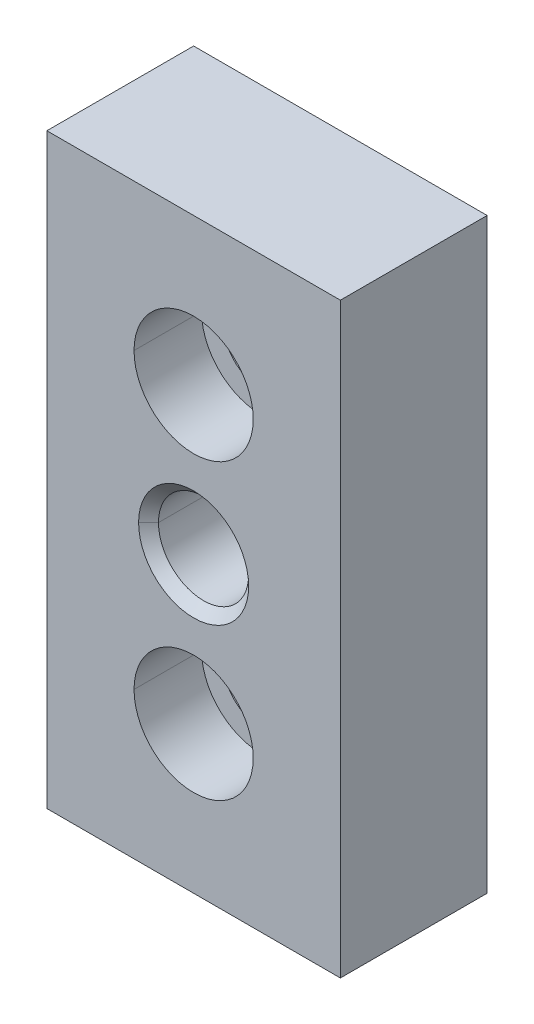
ISO-10303-21;
HEADER;
FILE_DESCRIPTION(('STEP AP214'),'2;1');
FILE_NAME('part.step','',(''),(''),'','','');
FILE_SCHEMA(('AUTOMOTIVE_DESIGN { 1 0 10303 214 1 1 1 1 }'));
ENDSEC;
DATA;
#1=APPLICATION_CONTEXT('core data for automotive mechanical design processes');
#2=APPLICATION_PROTOCOL_DEFINITION('international standard','automotive_design',2000,#1);
#3=PRODUCT_CONTEXT('',#1,'mechanical');
#4=PRODUCT('Part','Part','',(#3));
#5=PRODUCT_RELATED_PRODUCT_CATEGORY('part','',(#4));
#6=PRODUCT_DEFINITION_FORMATION('','',#4);
#7=PRODUCT_DEFINITION_CONTEXT('part definition',#1,'design');
#8=PRODUCT_DEFINITION('design','',#6,#7);
#9=PRODUCT_DEFINITION_SHAPE('','',#8);
#10=(LENGTH_UNIT() NAMED_UNIT(*) SI_UNIT(.MILLI.,.METRE.));
#11=(NAMED_UNIT(*) PLANE_ANGLE_UNIT() SI_UNIT($,.RADIAN.));
#12=(NAMED_UNIT(*) SI_UNIT($,.STERADIAN.) SOLID_ANGLE_UNIT());
#13=UNCERTAINTY_MEASURE_WITH_UNIT(LENGTH_MEASURE(1.E-05),#10,'distance_accuracy_value','');
#14=(GEOMETRIC_REPRESENTATION_CONTEXT(3) GLOBAL_UNCERTAINTY_ASSIGNED_CONTEXT((#13)) GLOBAL_UNIT_ASSIGNED_CONTEXT((#10,
#11,#12)) REPRESENTATION_CONTEXT('',''));
#15=CARTESIAN_POINT('',(0.,0.,0.));
#16=DIRECTION('',(0.,0.,1.));
#17=DIRECTION('',(1.,0.,0.));
#18=AXIS2_PLACEMENT_3D('',#15,#16,#17);
#19=CARTESIAN_POINT('',(-12.7,-25.4,0.));
#20=DIRECTION('',(0.,-1.,0.));
#21=DIRECTION('',(0.,0.,-1.));
#22=AXIS2_PLACEMENT_3D('',#19,#20,#21);
#23=PLANE('',#22);
#24=DIRECTION('',(1.,0.,0.));
#25=VECTOR('',#24,1.);
#26=CARTESIAN_POINT('',(-12.7,-25.4,12.7));
#27=LINE('',#26,#25);
#28=CARTESIAN_POINT('',(-12.7,-25.4,12.7));
#29=VERTEX_POINT('',#28);
#30=CARTESIAN_POINT('',(12.7,-25.4,12.7));
#31=VERTEX_POINT('',#30);
#32=EDGE_CURVE('E11',#29,#31,#27,.T.);
#33=ORIENTED_EDGE('',*,*,#32,.F.);
#34=DIRECTION('',(0.,0.,1.));
#35=VECTOR('',#34,1.);
#36=CARTESIAN_POINT('',(-12.7,-25.4,0.));
#37=LINE('',#36,#35);
#38=CARTESIAN_POINT('',(-12.7,-25.4,0.));
#39=VERTEX_POINT('',#38);
#40=EDGE_CURVE('E25',#39,#29,#37,.T.);
#41=ORIENTED_EDGE('',*,*,#40,.F.);
#42=DIRECTION('',(1.,0.,0.));
#43=VECTOR('',#42,1.);
#44=CARTESIAN_POINT('',(-12.7,-25.4,0.));
#45=LINE('',#44,#43);
#46=CARTESIAN_POINT('',(12.7,-25.4,0.));
#47=VERTEX_POINT('',#46);
#48=EDGE_CURVE('E350',#39,#47,#45,.T.);
#49=ORIENTED_EDGE('',*,*,#48,.T.);
#50=DIRECTION('',(0.,0.,1.));
#51=VECTOR('',#50,1.);
#52=CARTESIAN_POINT('',(12.7,-25.4,0.));
#53=LINE('',#52,#51);
#54=EDGE_CURVE('E346',#47,#31,#53,.T.);
#55=ORIENTED_EDGE('',*,*,#54,.T.);
#56=EDGE_LOOP('',(#33,#41,#49,#55));
#57=FACE_BOUND('',#56,.T.);
#58=ADVANCED_FACE('F17',(#57),#23,.T.);
#59=CARTESIAN_POINT('',(12.7,-25.4,0.));
#60=DIRECTION('',(1.,0.,0.));
#61=DIRECTION('',(0.,0.,-1.));
#62=AXIS2_PLACEMENT_3D('',#59,#60,#61);
#63=PLANE('',#62);
#64=DIRECTION('',(0.,1.,0.));
#65=VECTOR('',#64,1.);
#66=CARTESIAN_POINT('',(12.7,-25.4,12.7));
#67=LINE('',#66,#65);
#68=CARTESIAN_POINT('',(12.7,25.4,12.7));
#69=VERTEX_POINT('',#68);
#70=EDGE_CURVE('E341',#31,#69,#67,.T.);
#71=ORIENTED_EDGE('',*,*,#70,.F.);
#72=ORIENTED_EDGE('',*,*,#54,.F.);
#73=DIRECTION('',(0.,1.,0.));
#74=VECTOR('',#73,1.);
#75=CARTESIAN_POINT('',(12.7,-25.4,0.));
#76=LINE('',#75,#74);
#77=CARTESIAN_POINT('',(12.7,25.4,0.));
#78=VERTEX_POINT('',#77);
#79=EDGE_CURVE('E337',#47,#78,#76,.T.);
#80=ORIENTED_EDGE('',*,*,#79,.T.);
#81=DIRECTION('',(0.,0.,1.));
#82=VECTOR('',#81,1.);
#83=CARTESIAN_POINT('',(12.7,25.4,0.));
#84=LINE('',#83,#82);
#85=EDGE_CURVE('E333',#78,#69,#84,.T.);
#86=ORIENTED_EDGE('',*,*,#85,.T.);
#87=EDGE_LOOP('',(#71,#72,#80,#86));
#88=FACE_BOUND('',#87,.T.);
#89=ADVANCED_FACE('F371',(#88),#63,.T.);
#90=CARTESIAN_POINT('',(12.7,25.4,0.));
#91=DIRECTION('',(0.,1.,0.));
#92=DIRECTION('',(0.,0.,1.));
#93=AXIS2_PLACEMENT_3D('',#90,#91,#92);
#94=PLANE('',#93);
#95=DIRECTION('',(-1.,0.,0.));
#96=VECTOR('',#95,1.);
#97=CARTESIAN_POINT('',(12.7,25.4,12.7));
#98=LINE('',#97,#96);
#99=CARTESIAN_POINT('',(-12.7,25.4,12.7));
#100=VERTEX_POINT('',#99);
#101=EDGE_CURVE('E328',#69,#100,#98,.T.);
#102=ORIENTED_EDGE('',*,*,#101,.F.);
#103=ORIENTED_EDGE('',*,*,#85,.F.);
#104=DIRECTION('',(-1.,0.,0.));
#105=VECTOR('',#104,1.);
#106=CARTESIAN_POINT('',(12.7,25.4,0.));
#107=LINE('',#106,#105);
#108=CARTESIAN_POINT('',(-12.7,25.4,0.));
#109=VERTEX_POINT('',#108);
#110=EDGE_CURVE('E324',#78,#109,#107,.T.);
#111=ORIENTED_EDGE('',*,*,#110,.T.);
#112=DIRECTION('',(0.,0.,1.));
#113=VECTOR('',#112,1.);
#114=CARTESIAN_POINT('',(-12.7,25.4,0.));
#115=LINE('',#114,#113);
#116=EDGE_CURVE('E320',#109,#100,#115,.T.);
#117=ORIENTED_EDGE('',*,*,#116,.T.);
#118=EDGE_LOOP('',(#102,#103,#111,#117));
#119=FACE_BOUND('',#118,.T.);
#120=ADVANCED_FACE('F377',(#119),#94,.T.);
#121=CARTESIAN_POINT('',(-12.7,25.4,0.));
#122=DIRECTION('',(-1.,0.,0.));
#123=DIRECTION('',(0.,0.,1.));
#124=AXIS2_PLACEMENT_3D('',#121,#122,#123);
#125=PLANE('',#124);
#126=DIRECTION('',(0.,-1.,0.));
#127=VECTOR('',#126,1.);
#128=CARTESIAN_POINT('',(-12.7,25.4,12.7));
#129=LINE('',#128,#127);
#130=EDGE_CURVE('E316',#100,#29,#129,.T.);
#131=ORIENTED_EDGE('',*,*,#130,.F.);
#132=ORIENTED_EDGE('',*,*,#116,.F.);
#133=DIRECTION('',(0.,-1.,0.));
#134=VECTOR('',#133,1.);
#135=CARTESIAN_POINT('',(-12.7,25.4,0.));
#136=LINE('',#135,#134);
#137=EDGE_CURVE('E312',#109,#39,#136,.T.);
#138=ORIENTED_EDGE('',*,*,#137,.T.);
#139=ORIENTED_EDGE('',*,*,#40,.T.);
#140=EDGE_LOOP('',(#131,#132,#138,#139));
#141=FACE_BOUND('',#140,.T.);
#142=ADVANCED_FACE('F360',(#141),#125,.T.);
#143=CARTESIAN_POINT('',(0.,0.,0.));
#144=DIRECTION('',(0.,0.,1.));
#145=DIRECTION('',(1.,0.,0.));
#146=AXIS2_PLACEMENT_3D('',#143,#144,#145);
#147=PLANE('',#146);
#148=CARTESIAN_POINT('',(0.,-12.7,0.));
#149=DIRECTION('',(0.,0.,1.));
#150=DIRECTION('',(1.,0.,0.));
#151=AXIS2_PLACEMENT_3D('',#148,#149,#150);
#152=CIRCLE('',#151,3.2639);
#153=CARTESIAN_POINT('',(3.2639,-12.7,0.));
#154=VERTEX_POINT('',#153);
#155=CARTESIAN_POINT('',(-3.2639,-12.7,0.));
#156=VERTEX_POINT('',#155);
#157=EDGE_CURVE('E139',#154,#156,#152,.T.);
#158=ORIENTED_EDGE('',*,*,#157,.T.);
#159=CARTESIAN_POINT('',(0.,-12.7,0.));
#160=DIRECTION('',(0.,0.,1.));
#161=DIRECTION('',(1.,0.,0.));
#162=AXIS2_PLACEMENT_3D('',#159,#160,#161);
#163=CIRCLE('',#162,3.2639);
#164=EDGE_CURVE('E305',#156,#154,#163,.T.);
#165=ORIENTED_EDGE('',*,*,#164,.T.);
#166=EDGE_LOOP('',(#158,#165));
#167=FACE_BOUND('',#166,.T.);
#168=CARTESIAN_POINT('',(0.,12.7,0.));
#169=DIRECTION('',(0.,0.,1.));
#170=DIRECTION('',(1.,0.,0.));
#171=AXIS2_PLACEMENT_3D('',#168,#169,#170);
#172=CIRCLE('',#171,3.2639);
#173=CARTESIAN_POINT('',(3.2639,12.7,0.));
#174=VERTEX_POINT('',#173);
#175=CARTESIAN_POINT('',(-3.2639,12.7,0.));
#176=VERTEX_POINT('',#175);
#177=EDGE_CURVE('E301',#174,#176,#172,.T.);
#178=ORIENTED_EDGE('',*,*,#177,.T.);
#179=CARTESIAN_POINT('',(0.,12.7,0.));
#180=DIRECTION('',(0.,0.,1.));
#181=DIRECTION('',(1.,0.,0.));
#182=AXIS2_PLACEMENT_3D('',#179,#180,#181);
#183=CIRCLE('',#182,3.2639);
#184=EDGE_CURVE('E297',#176,#174,#183,.T.);
#185=ORIENTED_EDGE('',*,*,#184,.T.);
#186=EDGE_LOOP('',(#178,#185));
#187=FACE_BOUND('',#186,.T.);
#188=CARTESIAN_POINT('',(0.,0.,0.));
#189=DIRECTION('',(0.,0.,-1.));
#190=DIRECTION('',(-1.,0.,0.));
#191=AXIS2_PLACEMENT_3D('',#188,#189,#190);
#192=CIRCLE('',#191,4.7625);
#193=CARTESIAN_POINT('',(4.7625,0.,0.));
#194=VERTEX_POINT('',#193);
#195=CARTESIAN_POINT('',(-4.7625,0.,0.));
#196=VERTEX_POINT('',#195);
#197=EDGE_CURVE('E292',#194,#196,#192,.T.);
#198=ORIENTED_EDGE('',*,*,#197,.F.);
#199=CARTESIAN_POINT('',(0.,0.,0.));
#200=DIRECTION('',(0.,0.,-1.));
#201=DIRECTION('',(-1.,0.,0.));
#202=AXIS2_PLACEMENT_3D('',#199,#200,#201);
#203=CIRCLE('',#202,4.7625);
#204=EDGE_CURVE('E287',#196,#194,#203,.T.);
#205=ORIENTED_EDGE('',*,*,#204,.F.);
#206=EDGE_LOOP('',(#198,#205));
#207=FACE_BOUND('',#206,.T.);
#208=ORIENTED_EDGE('',*,*,#48,.F.);
#209=ORIENTED_EDGE('',*,*,#137,.F.);
#210=ORIENTED_EDGE('',*,*,#110,.F.);
#211=ORIENTED_EDGE('',*,*,#79,.F.);
#212=EDGE_LOOP('',(#208,#209,#210,#211));
#213=FACE_BOUND('',#212,.T.);
#214=ADVANCED_FACE('F367',(#167,#187,#207,#213),#147,.F.);
#215=CARTESIAN_POINT('',(0.,0.,0.85979));
#216=DIRECTION('',(0.,0.,-1.));
#217=DIRECTION('',(0.,-1.,0.));
#218=AXIS2_PLACEMENT_3D('',#215,#216,#217);
#219=CONICAL_SURFACE('',#218,3.90271,0.785398163397448);
#220=DIRECTION('',(0.707106781186547,0.,-0.707106781186548));
#221=VECTOR('',#220,1.);
#222=CARTESIAN_POINT('',(3.90271,0.,0.85979));
#223=LINE('',#222,#221);
#224=CARTESIAN_POINT('',(3.90271,0.,0.85979));
#225=VERTEX_POINT('',#224);
#226=EDGE_CURVE('E282',#225,#194,#223,.T.);
#227=ORIENTED_EDGE('',*,*,#226,.F.);
#228=CARTESIAN_POINT('',(0.,0.,0.85979));
#229=DIRECTION('',(0.,0.,-1.));
#230=DIRECTION('',(-1.,0.,0.));
#231=AXIS2_PLACEMENT_3D('',#228,#229,#230);
#232=CIRCLE('',#231,3.90271);
#233=CARTESIAN_POINT('',(-3.90271,0.,0.85979));
#234=VERTEX_POINT('',#233);
#235=EDGE_CURVE('E277',#234,#225,#232,.T.);
#236=ORIENTED_EDGE('',*,*,#235,.F.);
#237=DIRECTION('',(-0.707106781186547,0.,-0.707106781186548));
#238=VECTOR('',#237,1.);
#239=CARTESIAN_POINT('',(-3.90271,0.,0.85979));
#240=LINE('',#239,#238);
#241=EDGE_CURVE('E272',#234,#196,#240,.T.);
#242=ORIENTED_EDGE('',*,*,#241,.T.);
#243=ORIENTED_EDGE('',*,*,#204,.T.);
#244=EDGE_LOOP('',(#227,#236,#242,#243));
#245=FACE_BOUND('',#244,.T.);
#246=ADVANCED_FACE('F420',(#245),#219,.F.);
#247=CARTESIAN_POINT('',(0.,0.,0.85979));
#248=DIRECTION('',(0.,0.,-1.));
#249=DIRECTION('',(0.,1.,0.));
#250=AXIS2_PLACEMENT_3D('',#247,#248,#249);
#251=CONICAL_SURFACE('',#250,3.90271,0.785398163397448);
#252=ORIENTED_EDGE('',*,*,#226,.T.);
#253=ORIENTED_EDGE('',*,*,#197,.T.);
#254=ORIENTED_EDGE('',*,*,#241,.F.);
#255=CARTESIAN_POINT('',(0.,0.,0.85979));
#256=DIRECTION('',(0.,0.,-1.));
#257=DIRECTION('',(-1.,0.,0.));
#258=AXIS2_PLACEMENT_3D('',#255,#256,#257);
#259=CIRCLE('',#258,3.90271);
#260=EDGE_CURVE('E267',#225,#234,#259,.T.);
#261=ORIENTED_EDGE('',*,*,#260,.F.);
#262=EDGE_LOOP('',(#252,#253,#254,#261));
#263=FACE_BOUND('',#262,.T.);
#264=ADVANCED_FACE('F431',(#263),#251,.F.);
#265=CARTESIAN_POINT('',(0.,0.,0.));
#266=DIRECTION('',(0.,0.,-1.));
#267=DIRECTION('',(-5.89359289319345E-10,1.,0.));
#268=AXIS2_PLACEMENT_3D('',#265,#266,#267);
#269=CYLINDRICAL_SURFACE('',#268,3.90271);
#270=DIRECTION('',(0.,0.,-1.));
#271=VECTOR('',#270,1.);
#272=CARTESIAN_POINT('',(3.90271,0.,11.84021));
#273=LINE('',#272,#271);
#274=CARTESIAN_POINT('',(3.90271,0.,11.84021));
#275=VERTEX_POINT('',#274);
#276=EDGE_CURVE('E262',#275,#225,#273,.T.);
#277=ORIENTED_EDGE('',*,*,#276,.T.);
#278=ORIENTED_EDGE('',*,*,#260,.T.);
#279=DIRECTION('',(0.,0.,-1.));
#280=VECTOR('',#279,1.);
#281=CARTESIAN_POINT('',(-3.90271,0.,11.84021));
#282=LINE('',#281,#280);
#283=CARTESIAN_POINT('',(-3.90271,0.,11.84021));
#284=VERTEX_POINT('',#283);
#285=EDGE_CURVE('E257',#284,#234,#282,.T.);
#286=ORIENTED_EDGE('',*,*,#285,.F.);
#287=CARTESIAN_POINT('',(0.,0.,11.84021));
#288=DIRECTION('',(0.,0.,-1.));
#289=DIRECTION('',(-1.,0.,0.));
#290=AXIS2_PLACEMENT_3D('',#287,#288,#289);
#291=CIRCLE('',#290,3.90271);
#292=EDGE_CURVE('E252',#275,#284,#291,.T.);
#293=ORIENTED_EDGE('',*,*,#292,.F.);
#294=EDGE_LOOP('',(#277,#278,#286,#293));
#295=FACE_BOUND('',#294,.T.);
#296=ADVANCED_FACE('F442',(#295),#269,.F.);
#297=CARTESIAN_POINT('',(0.,0.,12.7));
#298=DIRECTION('',(0.,0.,1.));
#299=DIRECTION('',(0.,1.,0.));
#300=AXIS2_PLACEMENT_3D('',#297,#298,#299);
#301=CONICAL_SURFACE('',#300,4.7625,0.785398163397448);
#302=DIRECTION('',(-0.707106781186547,0.,0.707106781186548));
#303=VECTOR('',#302,1.);
#304=CARTESIAN_POINT('',(-3.90271,0.,11.84021));
#305=LINE('',#304,#303);
#306=CARTESIAN_POINT('',(-4.7625,0.,12.7));
#307=VERTEX_POINT('',#306);
#308=EDGE_CURVE('E248',#284,#307,#305,.T.);
#309=ORIENTED_EDGE('',*,*,#308,.T.);
#310=CARTESIAN_POINT('',(0.,0.,12.7));
#311=DIRECTION('',(0.,0.,-1.));
#312=DIRECTION('',(-1.,0.,0.));
#313=AXIS2_PLACEMENT_3D('',#310,#311,#312);
#314=CIRCLE('',#313,4.7625);
#315=CARTESIAN_POINT('',(4.7625,0.,12.7));
#316=VERTEX_POINT('',#315);
#317=EDGE_CURVE('E243',#316,#307,#314,.T.);
#318=ORIENTED_EDGE('',*,*,#317,.F.);
#319=DIRECTION('',(0.707106781186547,0.,0.707106781186548));
#320=VECTOR('',#319,1.);
#321=CARTESIAN_POINT('',(3.90271,0.,11.84021));
#322=LINE('',#321,#320);
#323=EDGE_CURVE('E238',#275,#316,#322,.T.);
#324=ORIENTED_EDGE('',*,*,#323,.F.);
#325=ORIENTED_EDGE('',*,*,#292,.T.);
#326=EDGE_LOOP('',(#309,#318,#324,#325));
#327=FACE_BOUND('',#326,.T.);
#328=ADVANCED_FACE('F453',(#327),#301,.F.);
#329=CARTESIAN_POINT('',(0.,0.,12.7));
#330=DIRECTION('',(0.,0.,1.));
#331=DIRECTION('',(0.,-1.,0.));
#332=AXIS2_PLACEMENT_3D('',#329,#330,#331);
#333=CONICAL_SURFACE('',#332,4.7625,0.785398163397448);
#334=ORIENTED_EDGE('',*,*,#308,.F.);
#335=CARTESIAN_POINT('',(0.,0.,11.84021));
#336=DIRECTION('',(0.,0.,-1.));
#337=DIRECTION('',(-1.,0.,0.));
#338=AXIS2_PLACEMENT_3D('',#335,#336,#337);
#339=CIRCLE('',#338,3.90271);
#340=EDGE_CURVE('E233',#284,#275,#339,.T.);
#341=ORIENTED_EDGE('',*,*,#340,.T.);
#342=ORIENTED_EDGE('',*,*,#323,.T.);
#343=CARTESIAN_POINT('',(0.,0.,12.7));
#344=DIRECTION('',(0.,0.,-1.));
#345=DIRECTION('',(-1.,0.,0.));
#346=AXIS2_PLACEMENT_3D('',#343,#344,#345);
#347=CIRCLE('',#346,4.7625);
#348=EDGE_CURVE('E228',#307,#316,#347,.T.);
#349=ORIENTED_EDGE('',*,*,#348,.F.);
#350=EDGE_LOOP('',(#334,#341,#342,#349));
#351=FACE_BOUND('',#350,.T.);
#352=ADVANCED_FACE('F464',(#351),#333,.F.);
#353=CARTESIAN_POINT('',(0.,0.,12.7));
#354=DIRECTION('',(0.,0.,1.));
#355=DIRECTION('',(1.,0.,0.));
#356=AXIS2_PLACEMENT_3D('',#353,#354,#355);
#357=PLANE('',#356);
#358=CARTESIAN_POINT('',(0.,-12.7,12.7));
#359=DIRECTION('',(0.,0.,1.));
#360=DIRECTION('',(1.,0.,0.));
#361=AXIS2_PLACEMENT_3D('',#358,#359,#360);
#362=CIRCLE('',#361,5.1562);
#363=CARTESIAN_POINT('',(-5.1562,-12.7,12.7));
#364=VERTEX_POINT('',#363);
#365=CARTESIAN_POINT('',(5.1562,-12.7,12.7));
#366=VERTEX_POINT('',#365);
#367=EDGE_CURVE('E223',#364,#366,#362,.T.);
#368=ORIENTED_EDGE('',*,*,#367,.F.);
#369=CARTESIAN_POINT('',(0.,-12.7,12.7));
#370=DIRECTION('',(0.,0.,1.));
#371=DIRECTION('',(1.,0.,0.));
#372=AXIS2_PLACEMENT_3D('',#369,#370,#371);
#373=CIRCLE('',#372,5.1562);
#374=EDGE_CURVE('E218',#366,#364,#373,.T.);
#375=ORIENTED_EDGE('',*,*,#374,.F.);
#376=EDGE_LOOP('',(#368,#375));
#377=FACE_BOUND('',#376,.T.);
#378=CARTESIAN_POINT('',(0.,12.7,12.7));
#379=DIRECTION('',(0.,0.,1.));
#380=DIRECTION('',(1.,0.,0.));
#381=AXIS2_PLACEMENT_3D('',#378,#379,#380);
#382=CIRCLE('',#381,5.1562);
#383=CARTESIAN_POINT('',(-5.1562,12.7,12.7));
#384=VERTEX_POINT('',#383);
#385=CARTESIAN_POINT('',(5.1562,12.7,12.7));
#386=VERTEX_POINT('',#385);
#387=EDGE_CURVE('E213',#384,#386,#382,.T.);
#388=ORIENTED_EDGE('',*,*,#387,.F.);
#389=CARTESIAN_POINT('',(0.,12.7,12.7));
#390=DIRECTION('',(0.,0.,1.));
#391=DIRECTION('',(1.,0.,0.));
#392=AXIS2_PLACEMENT_3D('',#389,#390,#391);
#393=CIRCLE('',#392,5.1562);
#394=EDGE_CURVE('E208',#386,#384,#393,.T.);
#395=ORIENTED_EDGE('',*,*,#394,.F.);
#396=EDGE_LOOP('',(#388,#395));
#397=FACE_BOUND('',#396,.T.);
#398=ORIENTED_EDGE('',*,*,#348,.T.);
#399=ORIENTED_EDGE('',*,*,#317,.T.);
#400=EDGE_LOOP('',(#398,#399));
#401=FACE_BOUND('',#400,.T.);
#402=ORIENTED_EDGE('',*,*,#32,.T.);
#403=ORIENTED_EDGE('',*,*,#70,.T.);
#404=ORIENTED_EDGE('',*,*,#101,.T.);
#405=ORIENTED_EDGE('',*,*,#130,.T.);
#406=EDGE_LOOP('',(#402,#403,#404,#405));
#407=FACE_BOUND('',#406,.T.);
#408=ADVANCED_FACE('F375',(#377,#397,#401,#407),#357,.T.);
#409=CARTESIAN_POINT('',(0.,12.7,12.7));
#410=DIRECTION('',(0.,0.,1.));
#411=DIRECTION('',(0.,-1.,0.));
#412=AXIS2_PLACEMENT_3D('',#409,#410,#411);
#413=CYLINDRICAL_SURFACE('',#412,5.1562);
#414=DIRECTION('',(0.,0.,1.));
#415=VECTOR('',#414,1.);
#416=CARTESIAN_POINT('',(-5.1562,12.7,6.858));
#417=LINE('',#416,#415);
#418=CARTESIAN_POINT('',(-5.1562,12.7,6.858));
#419=VERTEX_POINT('',#418);
#420=EDGE_CURVE('E203',#419,#384,#417,.T.);
#421=ORIENTED_EDGE('',*,*,#420,.F.);
#422=CARTESIAN_POINT('',(0.,12.7,6.858));
#423=DIRECTION('',(0.,0.,1.));
#424=DIRECTION('',(1.,0.,0.));
#425=AXIS2_PLACEMENT_3D('',#422,#423,#424);
#426=CIRCLE('',#425,5.1562);
#427=CARTESIAN_POINT('',(5.1562,12.7,6.858));
#428=VERTEX_POINT('',#427);
#429=EDGE_CURVE('E198',#428,#419,#426,.T.);
#430=ORIENTED_EDGE('',*,*,#429,.F.);
#431=DIRECTION('',(0.,0.,1.));
#432=VECTOR('',#431,1.);
#433=CARTESIAN_POINT('',(5.1562,12.7,6.858));
#434=LINE('',#433,#432);
#435=EDGE_CURVE('E193',#428,#386,#434,.T.);
#436=ORIENTED_EDGE('',*,*,#435,.T.);
#437=ORIENTED_EDGE('',*,*,#394,.T.);
#438=EDGE_LOOP('',(#421,#430,#436,#437));
#439=FACE_BOUND('',#438,.T.);
#440=ADVANCED_FACE('F485',(#439),#413,.F.);
#441=CARTESIAN_POINT('',(0.,12.7,12.7));
#442=DIRECTION('',(0.,0.,1.));
#443=DIRECTION('',(0.,1.,0.));
#444=AXIS2_PLACEMENT_3D('',#441,#442,#443);
#445=CYLINDRICAL_SURFACE('',#444,5.1562);
#446=ORIENTED_EDGE('',*,*,#420,.T.);
#447=ORIENTED_EDGE('',*,*,#387,.T.);
#448=ORIENTED_EDGE('',*,*,#435,.F.);
#449=CARTESIAN_POINT('',(0.,12.7,6.858));
#450=DIRECTION('',(0.,0.,1.));
#451=DIRECTION('',(1.,0.,0.));
#452=AXIS2_PLACEMENT_3D('',#449,#450,#451);
#453=CIRCLE('',#452,5.1562);
#454=EDGE_CURVE('E188',#419,#428,#453,.T.);
#455=ORIENTED_EDGE('',*,*,#454,.F.);
#456=EDGE_LOOP('',(#446,#447,#448,#455));
#457=FACE_BOUND('',#456,.T.);
#458=ADVANCED_FACE('F496',(#457),#445,.F.);
#459=CARTESIAN_POINT('',(3.2639,12.7,6.858));
#460=DIRECTION('',(0.,0.,1.));
#461=DIRECTION('',(1.,0.,0.));
#462=AXIS2_PLACEMENT_3D('',#459,#460,#461);
#463=PLANE('',#462);
#464=ORIENTED_EDGE('',*,*,#429,.T.);
#465=ORIENTED_EDGE('',*,*,#454,.T.);
#466=EDGE_LOOP('',(#464,#465));
#467=FACE_BOUND('',#466,.T.);
#468=CARTESIAN_POINT('',(0.,12.7,6.858));
#469=DIRECTION('',(0.,0.,1.));
#470=DIRECTION('',(1.,0.,0.));
#471=AXIS2_PLACEMENT_3D('',#468,#469,#470);
#472=CIRCLE('',#471,3.2639);
#473=CARTESIAN_POINT('',(-3.2639,12.7,6.858));
#474=VERTEX_POINT('',#473);
#475=CARTESIAN_POINT('',(3.2639,12.7,6.858));
#476=VERTEX_POINT('',#475);
#477=EDGE_CURVE('E183',#474,#476,#472,.T.);
#478=ORIENTED_EDGE('',*,*,#477,.F.);
#479=CARTESIAN_POINT('',(0.,12.7,6.858));
#480=DIRECTION('',(0.,0.,1.));
#481=DIRECTION('',(1.,0.,0.));
#482=AXIS2_PLACEMENT_3D('',#479,#480,#481);
#483=CIRCLE('',#482,3.2639);
#484=EDGE_CURVE('E178',#476,#474,#483,.T.);
#485=ORIENTED_EDGE('',*,*,#484,.F.);
#486=EDGE_LOOP('',(#478,#485));
#487=FACE_BOUND('',#486,.T.);
#488=ADVANCED_FACE('F507',(#467,#487),#463,.T.);
#489=CARTESIAN_POINT('',(0.,12.7,12.7));
#490=DIRECTION('',(0.,0.,1.));
#491=DIRECTION('',(0.,-1.,0.));
#492=AXIS2_PLACEMENT_3D('',#489,#490,#491);
#493=CYLINDRICAL_SURFACE('',#492,3.2639);
#494=DIRECTION('',(0.,0.,1.));
#495=VECTOR('',#494,1.);
#496=CARTESIAN_POINT('',(-3.2639,12.7,0.));
#497=LINE('',#496,#495);
#498=EDGE_CURVE('E173',#176,#474,#497,.T.);
#499=ORIENTED_EDGE('',*,*,#498,.F.);
#500=ORIENTED_EDGE('',*,*,#177,.F.);
#501=DIRECTION('',(0.,0.,1.));
#502=VECTOR('',#501,1.);
#503=CARTESIAN_POINT('',(3.2639,12.7,0.));
#504=LINE('',#503,#502);
#505=EDGE_CURVE('E168',#174,#476,#504,.T.);
#506=ORIENTED_EDGE('',*,*,#505,.T.);
#507=ORIENTED_EDGE('',*,*,#484,.T.);
#508=EDGE_LOOP('',(#499,#500,#506,#507));
#509=FACE_BOUND('',#508,.T.);
#510=ADVANCED_FACE('F518',(#509),#493,.F.);
#511=CARTESIAN_POINT('',(0.,12.7,12.7));
#512=DIRECTION('',(0.,0.,1.));
#513=DIRECTION('',(0.,1.,0.));
#514=AXIS2_PLACEMENT_3D('',#511,#512,#513);
#515=CYLINDRICAL_SURFACE('',#514,3.2639);
#516=ORIENTED_EDGE('',*,*,#498,.T.);
#517=ORIENTED_EDGE('',*,*,#477,.T.);
#518=ORIENTED_EDGE('',*,*,#505,.F.);
#519=ORIENTED_EDGE('',*,*,#184,.F.);
#520=EDGE_LOOP('',(#516,#517,#518,#519));
#521=FACE_BOUND('',#520,.T.);
#522=ADVANCED_FACE('F529',(#521),#515,.F.);
#523=CARTESIAN_POINT('',(0.,-12.7,12.7));
#524=DIRECTION('',(0.,0.,1.));
#525=DIRECTION('',(0.,-1.,0.));
#526=AXIS2_PLACEMENT_3D('',#523,#524,#525);
#527=CYLINDRICAL_SURFACE('',#526,5.1562);
#528=DIRECTION('',(0.,0.,1.));
#529=VECTOR('',#528,1.);
#530=CARTESIAN_POINT('',(-5.1562,-12.7,6.858));
#531=LINE('',#530,#529);
#532=CARTESIAN_POINT('',(-5.1562,-12.7,6.858));
#533=VERTEX_POINT('',#532);
#534=EDGE_CURVE('E163',#533,#364,#531,.T.);
#535=ORIENTED_EDGE('',*,*,#534,.F.);
#536=CARTESIAN_POINT('',(0.,-12.7,6.858));
#537=DIRECTION('',(0.,0.,1.));
#538=DIRECTION('',(1.,0.,0.));
#539=AXIS2_PLACEMENT_3D('',#536,#537,#538);
#540=CIRCLE('',#539,5.1562);
#541=CARTESIAN_POINT('',(5.1562,-12.7,6.858));
#542=VERTEX_POINT('',#541);
#543=EDGE_CURVE('E158',#542,#533,#540,.T.);
#544=ORIENTED_EDGE('',*,*,#543,.F.);
#545=DIRECTION('',(0.,0.,1.));
#546=VECTOR('',#545,1.);
#547=CARTESIAN_POINT('',(5.1562,-12.7,6.858));
#548=LINE('',#547,#546);
#549=EDGE_CURVE('E147',#542,#366,#548,.T.);
#550=ORIENTED_EDGE('',*,*,#549,.T.);
#551=ORIENTED_EDGE('',*,*,#374,.T.);
#552=EDGE_LOOP('',(#535,#544,#550,#551));
#553=FACE_BOUND('',#552,.T.);
#554=ADVANCED_FACE('F540',(#553),#527,.F.);
#555=CARTESIAN_POINT('',(0.,-12.7,12.7));
#556=DIRECTION('',(0.,0.,1.));
#557=DIRECTION('',(0.,1.,0.));
#558=AXIS2_PLACEMENT_3D('',#555,#556,#557);
#559=CYLINDRICAL_SURFACE('',#558,5.1562);
#560=ORIENTED_EDGE('',*,*,#534,.T.);
#561=ORIENTED_EDGE('',*,*,#367,.T.);
#562=ORIENTED_EDGE('',*,*,#549,.F.);
#563=CARTESIAN_POINT('',(0.,-12.7,6.858));
#564=DIRECTION('',(0.,0.,1.));
#565=DIRECTION('',(1.,0.,0.));
#566=AXIS2_PLACEMENT_3D('',#563,#564,#565);
#567=CIRCLE('',#566,5.1562);
#568=EDGE_CURVE('E144',#533,#542,#567,.T.);
#569=ORIENTED_EDGE('',*,*,#568,.F.);
#570=EDGE_LOOP('',(#560,#561,#562,#569));
#571=FACE_BOUND('',#570,.T.);
#572=ADVANCED_FACE('F551',(#571),#559,.F.);
#573=CARTESIAN_POINT('',(3.2639,-12.7,6.858));
#574=DIRECTION('',(0.,0.,1.));
#575=DIRECTION('',(1.,0.,0.));
#576=AXIS2_PLACEMENT_3D('',#573,#574,#575);
#577=PLANE('',#576);
#578=ORIENTED_EDGE('',*,*,#543,.T.);
#579=ORIENTED_EDGE('',*,*,#568,.T.);
#580=EDGE_LOOP('',(#578,#579));
#581=FACE_BOUND('',#580,.T.);
#582=CARTESIAN_POINT('',(0.,-12.7,6.858));
#583=DIRECTION('',(0.,0.,1.));
#584=DIRECTION('',(1.,0.,0.));
#585=AXIS2_PLACEMENT_3D('',#582,#583,#584);
#586=CIRCLE('',#585,3.2639);
#587=CARTESIAN_POINT('',(-3.2639,-12.7,6.858));
#588=VERTEX_POINT('',#587);
#589=CARTESIAN_POINT('',(3.2639,-12.7,6.858));
#590=VERTEX_POINT('',#589);
#591=EDGE_CURVE('E129',#588,#590,#586,.T.);
#592=ORIENTED_EDGE('',*,*,#591,.F.);
#593=CARTESIAN_POINT('',(0.,-12.7,6.858));
#594=DIRECTION('',(0.,0.,1.));
#595=DIRECTION('',(1.,0.,0.));
#596=AXIS2_PLACEMENT_3D('',#593,#594,#595);
#597=CIRCLE('',#596,3.2639);
#598=EDGE_CURVE('E125',#590,#588,#597,.T.);
#599=ORIENTED_EDGE('',*,*,#598,.F.);
#600=EDGE_LOOP('',(#592,#599));
#601=FACE_BOUND('',#600,.T.);
#602=ADVANCED_FACE('F127',(#581,#601),#577,.T.);
#603=CARTESIAN_POINT('',(0.,-12.7,12.7));
#604=DIRECTION('',(0.,0.,1.));
#605=DIRECTION('',(0.,-1.,0.));
#606=AXIS2_PLACEMENT_3D('',#603,#604,#605);
#607=CYLINDRICAL_SURFACE('',#606,3.2639);
#608=DIRECTION('',(0.,0.,1.));
#609=VECTOR('',#608,1.);
#610=CARTESIAN_POINT('',(-3.2639,-12.7,0.));
#611=LINE('',#610,#609);
#612=EDGE_CURVE('E133',#156,#588,#611,.T.);
#613=ORIENTED_EDGE('',*,*,#612,.F.);
#614=ORIENTED_EDGE('',*,*,#157,.F.);
#615=DIRECTION('',(0.,0.,1.));
#616=VECTOR('',#615,1.);
#617=CARTESIAN_POINT('',(3.2639,-12.7,0.));
#618=LINE('',#617,#616);
#619=EDGE_CURVE('E137',#154,#590,#618,.T.);
#620=ORIENTED_EDGE('',*,*,#619,.T.);
#621=ORIENTED_EDGE('',*,*,#598,.T.);
#622=EDGE_LOOP('',(#613,#614,#620,#621));
#623=FACE_BOUND('',#622,.T.);
#624=ADVANCED_FACE('F138',(#623),#607,.F.);
#625=CARTESIAN_POINT('',(0.,-12.7,12.7));
#626=DIRECTION('',(0.,0.,1.));
#627=DIRECTION('',(0.,1.,0.));
#628=AXIS2_PLACEMENT_3D('',#625,#626,#627);
#629=CYLINDRICAL_SURFACE('',#628,3.2639);
#630=ORIENTED_EDGE('',*,*,#612,.T.);
#631=ORIENTED_EDGE('',*,*,#591,.T.);
#632=ORIENTED_EDGE('',*,*,#619,.F.);
#633=ORIENTED_EDGE('',*,*,#164,.F.);
#634=EDGE_LOOP('',(#630,#631,#632,#633));
#635=FACE_BOUND('',#634,.T.);
#636=ADVANCED_FACE('F143',(#635),#629,.F.);
#637=CARTESIAN_POINT('',(0.,0.,0.));
#638=DIRECTION('',(0.,0.,-1.));
#639=DIRECTION('',(0.,-1.,0.));
#640=AXIS2_PLACEMENT_3D('',#637,#638,#639);
#641=CYLINDRICAL_SURFACE('',#640,3.90271);
#642=ORIENTED_EDGE('',*,*,#276,.F.);
#643=ORIENTED_EDGE('',*,*,#340,.F.);
#644=ORIENTED_EDGE('',*,*,#285,.T.);
#645=ORIENTED_EDGE('',*,*,#235,.T.);
#646=EDGE_LOOP('',(#642,#643,#644,#645));
#647=FACE_BOUND('',#646,.T.);
#648=ADVANCED_FACE('F591',(#647),#641,.F.);
#649=CLOSED_SHELL('',(#58,#89,#120,#142,#214,#246,#264,#296,#328,#352,#408,#440,#458,#488,#510,
#522,#554,#572,#602,#624,#636,#648));
#650=MANIFOLD_SOLID_BREP('B1',#649);
#651=ADVANCED_BREP_SHAPE_REPRESENTATION('',(#18,#650),#14);
#652=SHAPE_DEFINITION_REPRESENTATION(#9,#651);
ENDSEC;
END-ISO-10303-21;
